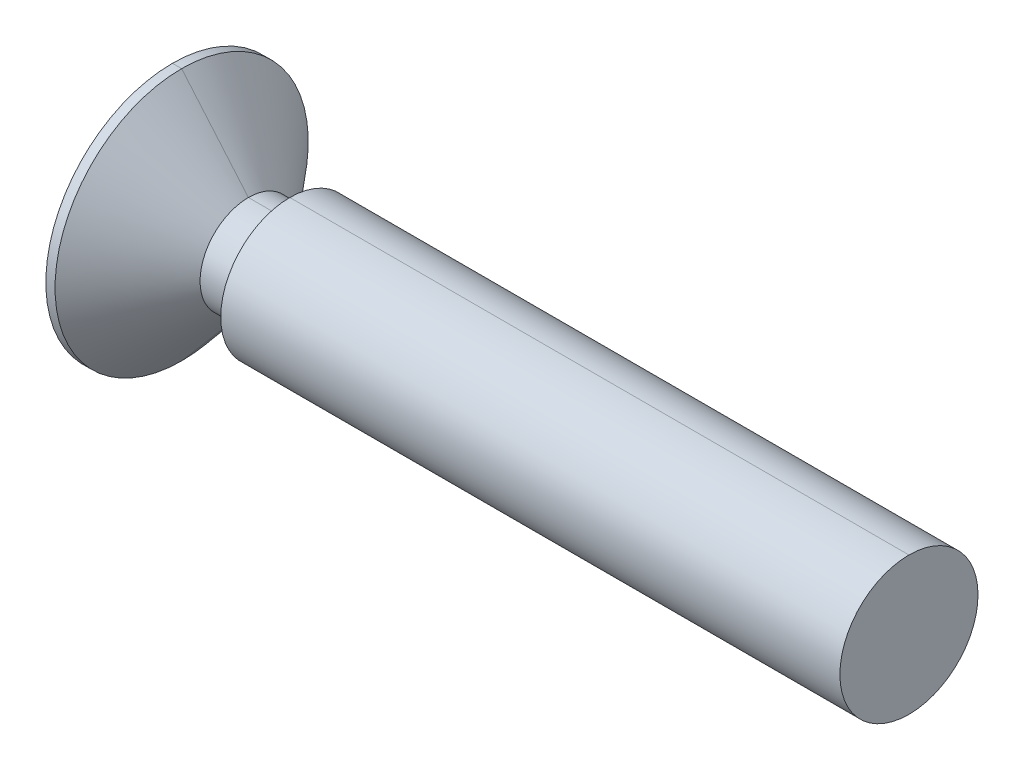
ISO-10303-21;
HEADER;
FILE_DESCRIPTION(('STEP AP214'),'2;1');
FILE_NAME('part.step','',(''),(''),'','','');
FILE_SCHEMA(('AUTOMOTIVE_DESIGN { 1 0 10303 214 1 1 1 1 }'));
ENDSEC;
DATA;
#1=APPLICATION_CONTEXT('core data for automotive mechanical design processes');
#2=APPLICATION_PROTOCOL_DEFINITION('international standard','automotive_design',2000,#1);
#3=PRODUCT_CONTEXT('',#1,'mechanical');
#4=PRODUCT('Part','Part','',(#3));
#5=PRODUCT_RELATED_PRODUCT_CATEGORY('part','',(#4));
#6=PRODUCT_DEFINITION_FORMATION('','',#4);
#7=PRODUCT_DEFINITION_CONTEXT('part definition',#1,'design');
#8=PRODUCT_DEFINITION('design','',#6,#7);
#9=PRODUCT_DEFINITION_SHAPE('','',#8);
#10=(LENGTH_UNIT() NAMED_UNIT(*) SI_UNIT(.MILLI.,.METRE.));
#11=(NAMED_UNIT(*) PLANE_ANGLE_UNIT() SI_UNIT($,.RADIAN.));
#12=(NAMED_UNIT(*) SI_UNIT($,.STERADIAN.) SOLID_ANGLE_UNIT());
#13=UNCERTAINTY_MEASURE_WITH_UNIT(LENGTH_MEASURE(1.E-05),#10,'distance_accuracy_value','');
#14=(GEOMETRIC_REPRESENTATION_CONTEXT(3) GLOBAL_UNCERTAINTY_ASSIGNED_CONTEXT((#13)) GLOBAL_UNIT_ASSIGNED_CONTEXT((#10,
#11,#12)) REPRESENTATION_CONTEXT('',''));
#15=CARTESIAN_POINT('',(0.,0.,0.));
#16=DIRECTION('',(0.,0.,1.));
#17=DIRECTION('',(1.,0.,0.));
#18=AXIS2_PLACEMENT_3D('',#15,#16,#17);
#19=CARTESIAN_POINT('',(-15.175,0.675,-0.675));
#20=DIRECTION('',(1.,0.,0.));
#21=DIRECTION('',(0.,1.,0.));
#22=AXIS2_PLACEMENT_3D('',#19,#20,#21);
#23=PLANE('',#22);
#24=DIRECTION('',(0.,-1.,0.));
#25=VECTOR('',#24,1.);
#26=CARTESIAN_POINT('',(-15.175,1.8,-0.375));
#27=LINE('',#26,#25);
#28=CARTESIAN_POINT('',(-15.175,1.8,-0.375));
#29=VERTEX_POINT('',#28);
#30=CARTESIAN_POINT('',(-15.175,0.675,-0.375));
#31=VERTEX_POINT('',#30);
#32=EDGE_CURVE('E426',#29,#31,#27,.T.);
#33=ORIENTED_EDGE('',*,*,#32,.T.);
#34=CARTESIAN_POINT('',(-15.175,0.675,-0.675));
#35=DIRECTION('',(1.,0.,0.));
#36=DIRECTION('',(0.,1.,0.));
#37=AXIS2_PLACEMENT_3D('',#34,#35,#36);
#38=CIRCLE('',#37,0.3);
#39=CARTESIAN_POINT('',(-15.175,0.375,-0.675));
#40=VERTEX_POINT('',#39);
#41=EDGE_CURVE('E10',#31,#40,#38,.T.);
#42=ORIENTED_EDGE('',*,*,#41,.T.);
#43=DIRECTION('',(0.,0.,-1.));
#44=VECTOR('',#43,1.);
#45=CARTESIAN_POINT('',(-15.175,0.375,-1.8));
#46=LINE('',#45,#44);
#47=CARTESIAN_POINT('',(-15.175,0.375,-1.8));
#48=VERTEX_POINT('',#47);
#49=EDGE_CURVE('E260',#40,#48,#46,.T.);
#50=ORIENTED_EDGE('',*,*,#49,.T.);
#51=DIRECTION('',(0.,-1.,0.));
#52=VECTOR('',#51,1.);
#53=CARTESIAN_POINT('',(-15.175,0.375,-1.8));
#54=LINE('',#53,#52);
#55=CARTESIAN_POINT('',(-15.175,-0.375,-1.8));
#56=VERTEX_POINT('',#55);
#57=EDGE_CURVE('E358',#48,#56,#54,.T.);
#58=ORIENTED_EDGE('',*,*,#57,.T.);
#59=DIRECTION('',(0.,0.,1.));
#60=VECTOR('',#59,1.);
#61=CARTESIAN_POINT('',(-15.175,-0.375,-1.8));
#62=LINE('',#61,#60);
#63=CARTESIAN_POINT('',(-15.175,-0.375,-0.675));
#64=VERTEX_POINT('',#63);
#65=EDGE_CURVE('E173',#56,#64,#62,.T.);
#66=ORIENTED_EDGE('',*,*,#65,.T.);
#67=CARTESIAN_POINT('',(-15.175,-0.675,-0.675));
#68=DIRECTION('',(1.,0.,0.));
#69=DIRECTION('',(0.,-1.,0.));
#70=AXIS2_PLACEMENT_3D('',#67,#68,#69);
#71=CIRCLE('',#70,0.3);
#72=CARTESIAN_POINT('',(-15.175,-0.675,-0.375));
#73=VERTEX_POINT('',#72);
#74=EDGE_CURVE('E185',#64,#73,#71,.T.);
#75=ORIENTED_EDGE('',*,*,#74,.T.);
#76=DIRECTION('',(0.,-1.,0.));
#77=VECTOR('',#76,1.);
#78=CARTESIAN_POINT('',(-15.175,-0.675,-0.375));
#79=LINE('',#78,#77);
#80=CARTESIAN_POINT('',(-15.175,-1.8,-0.375));
#81=VERTEX_POINT('',#80);
#82=EDGE_CURVE('E290',#73,#81,#79,.T.);
#83=ORIENTED_EDGE('',*,*,#82,.T.);
#84=DIRECTION('',(0.,0.,1.));
#85=VECTOR('',#84,1.);
#86=CARTESIAN_POINT('',(-15.175,-1.8,-0.375));
#87=LINE('',#86,#85);
#88=CARTESIAN_POINT('',(-15.175,-1.8,0.375));
#89=VERTEX_POINT('',#88);
#90=EDGE_CURVE('E234',#81,#89,#87,.T.);
#91=ORIENTED_EDGE('',*,*,#90,.T.);
#92=DIRECTION('',(0.,1.,0.));
#93=VECTOR('',#92,1.);
#94=CARTESIAN_POINT('',(-15.175,-0.675,0.375));
#95=LINE('',#94,#93);
#96=CARTESIAN_POINT('',(-15.175,-0.675,0.375));
#97=VERTEX_POINT('',#96);
#98=EDGE_CURVE('E240',#89,#97,#95,.T.);
#99=ORIENTED_EDGE('',*,*,#98,.T.);
#100=CARTESIAN_POINT('',(-15.175,-0.675,0.675));
#101=DIRECTION('',(1.,0.,0.));
#102=DIRECTION('',(0.,1.,0.));
#103=AXIS2_PLACEMENT_3D('',#100,#101,#102);
#104=CIRCLE('',#103,0.3);
#105=CARTESIAN_POINT('',(-15.175,-0.375,0.675));
#106=VERTEX_POINT('',#105);
#107=EDGE_CURVE('E359',#97,#106,#104,.T.);
#108=ORIENTED_EDGE('',*,*,#107,.T.);
#109=DIRECTION('',(0.,0.,1.));
#110=VECTOR('',#109,1.);
#111=CARTESIAN_POINT('',(-15.175,-0.375,0.675));
#112=LINE('',#111,#110);
#113=CARTESIAN_POINT('',(-15.175,-0.375,1.8));
#114=VERTEX_POINT('',#113);
#115=EDGE_CURVE('E330',#106,#114,#112,.T.);
#116=ORIENTED_EDGE('',*,*,#115,.T.);
#117=DIRECTION('',(0.,1.,0.));
#118=VECTOR('',#117,1.);
#119=CARTESIAN_POINT('',(-15.175,0.375,1.8));
#120=LINE('',#119,#118);
#121=CARTESIAN_POINT('',(-15.175,0.375,1.8));
#122=VERTEX_POINT('',#121);
#123=EDGE_CURVE('E320',#114,#122,#120,.T.);
#124=ORIENTED_EDGE('',*,*,#123,.T.);
#125=DIRECTION('',(0.,0.,-1.));
#126=VECTOR('',#125,1.);
#127=CARTESIAN_POINT('',(-15.175,0.375,0.675));
#128=LINE('',#127,#126);
#129=CARTESIAN_POINT('',(-15.175,0.375,0.675));
#130=VERTEX_POINT('',#129);
#131=EDGE_CURVE('E333',#122,#130,#128,.T.);
#132=ORIENTED_EDGE('',*,*,#131,.T.);
#133=CARTESIAN_POINT('',(-15.175,0.675,0.675));
#134=DIRECTION('',(1.,0.,0.));
#135=DIRECTION('',(0.,1.,0.));
#136=AXIS2_PLACEMENT_3D('',#133,#134,#135);
#137=CIRCLE('',#136,0.3);
#138=CARTESIAN_POINT('',(-15.175,0.675,0.375));
#139=VERTEX_POINT('',#138);
#140=EDGE_CURVE('E293',#130,#139,#137,.T.);
#141=ORIENTED_EDGE('',*,*,#140,.T.);
#142=DIRECTION('',(0.,1.,0.));
#143=VECTOR('',#142,1.);
#144=CARTESIAN_POINT('',(-15.175,1.8,0.375));
#145=LINE('',#144,#143);
#146=CARTESIAN_POINT('',(-15.175,1.8,0.375));
#147=VERTEX_POINT('',#146);
#148=EDGE_CURVE('E294',#139,#147,#145,.T.);
#149=ORIENTED_EDGE('',*,*,#148,.T.);
#150=DIRECTION('',(0.,0.,-1.));
#151=VECTOR('',#150,1.);
#152=CARTESIAN_POINT('',(-15.175,1.8,-0.375));
#153=LINE('',#152,#151);
#154=EDGE_CURVE('E354',#147,#29,#153,.T.);
#155=ORIENTED_EDGE('',*,*,#154,.T.);
#156=EDGE_LOOP('',(#33,#42,#50,#58,#66,#75,#83,#91,#99,#108,#116,#124,#132,#141,#149,#155));
#157=FACE_BOUND('',#156,.T.);
#158=ADVANCED_FACE('F16',(#157),#23,.F.);
#159=CARTESIAN_POINT('',(-15.175,0.675,-0.675));
#160=DIRECTION('',(-1.,0.,0.));
#161=DIRECTION('',(0.,-1.,0.));
#162=AXIS2_PLACEMENT_3D('',#159,#160,#161);
#163=CYLINDRICAL_SURFACE('',#162,0.3);
#164=CARTESIAN_POINT('',(-16.,0.675,-0.675));
#165=DIRECTION('',(1.,0.,0.));
#166=DIRECTION('',(0.,1.,0.));
#167=AXIS2_PLACEMENT_3D('',#164,#165,#166);
#168=CIRCLE('',#167,0.3);
#169=CARTESIAN_POINT('',(-16.,0.675,-0.375));
#170=VERTEX_POINT('',#169);
#171=CARTESIAN_POINT('',(-16.,0.375,-0.675));
#172=VERTEX_POINT('',#171);
#173=EDGE_CURVE('E265',#170,#172,#168,.T.);
#174=ORIENTED_EDGE('',*,*,#173,.T.);
#175=DIRECTION('',(-1.,0.,0.));
#176=VECTOR('',#175,1.);
#177=CARTESIAN_POINT('',(-15.175,0.375,-0.675));
#178=LINE('',#177,#176);
#179=EDGE_CURVE('E27',#40,#172,#178,.T.);
#180=ORIENTED_EDGE('',*,*,#179,.F.);
#181=ORIENTED_EDGE('',*,*,#41,.F.);
#182=DIRECTION('',(-1.,0.,0.));
#183=VECTOR('',#182,1.);
#184=CARTESIAN_POINT('',(-15.175,0.675,-0.375));
#185=LINE('',#184,#183);
#186=EDGE_CURVE('E268',#31,#170,#185,.T.);
#187=ORIENTED_EDGE('',*,*,#186,.T.);
#188=EDGE_LOOP('',(#174,#180,#181,#187));
#189=FACE_BOUND('',#188,.T.);
#190=ADVANCED_FACE('F266',(#189),#163,.T.);
#191=CARTESIAN_POINT('',(-15.175,0.375,-1.8));
#192=DIRECTION('',(0.,1.,0.));
#193=DIRECTION('',(1.,0.,0.));
#194=AXIS2_PLACEMENT_3D('',#191,#192,#193);
#195=PLANE('',#194);
#196=DIRECTION('',(0.,0.,-1.));
#197=VECTOR('',#196,1.);
#198=CARTESIAN_POINT('',(-16.,0.375,-1.8));
#199=LINE('',#198,#197);
#200=CARTESIAN_POINT('',(-16.,0.375,-1.8));
#201=VERTEX_POINT('',#200);
#202=EDGE_CURVE('E258',#172,#201,#199,.T.);
#203=ORIENTED_EDGE('',*,*,#202,.T.);
#204=DIRECTION('',(-1.,0.,0.));
#205=VECTOR('',#204,1.);
#206=CARTESIAN_POINT('',(-15.175,0.375,-1.8));
#207=LINE('',#206,#205);
#208=EDGE_CURVE('E402',#48,#201,#207,.T.);
#209=ORIENTED_EDGE('',*,*,#208,.F.);
#210=ORIENTED_EDGE('',*,*,#49,.F.);
#211=ORIENTED_EDGE('',*,*,#179,.T.);
#212=EDGE_LOOP('',(#203,#209,#210,#211));
#213=FACE_BOUND('',#212,.T.);
#214=ADVANCED_FACE('F255',(#213),#195,.F.);
#215=CARTESIAN_POINT('',(-15.175,0.375,-1.8));
#216=DIRECTION('',(0.,0.,-1.));
#217=DIRECTION('',(0.,-1.,0.));
#218=AXIS2_PLACEMENT_3D('',#215,#216,#217);
#219=PLANE('',#218);
#220=DIRECTION('',(0.,-1.,0.));
#221=VECTOR('',#220,1.);
#222=CARTESIAN_POINT('',(-16.,0.375,-1.8));
#223=LINE('',#222,#221);
#224=CARTESIAN_POINT('',(-16.,-0.375,-1.8));
#225=VERTEX_POINT('',#224);
#226=EDGE_CURVE('E278',#201,#225,#223,.T.);
#227=ORIENTED_EDGE('',*,*,#226,.T.);
#228=DIRECTION('',(-1.,0.,0.));
#229=VECTOR('',#228,1.);
#230=CARTESIAN_POINT('',(-15.175,-0.375,-1.8));
#231=LINE('',#230,#229);
#232=EDGE_CURVE('E355',#56,#225,#231,.T.);
#233=ORIENTED_EDGE('',*,*,#232,.F.);
#234=ORIENTED_EDGE('',*,*,#57,.F.);
#235=ORIENTED_EDGE('',*,*,#208,.T.);
#236=EDGE_LOOP('',(#227,#233,#234,#235));
#237=FACE_BOUND('',#236,.T.);
#238=ADVANCED_FACE('F656',(#237),#219,.F.);
#239=CARTESIAN_POINT('',(-15.175,-0.375,-1.8));
#240=DIRECTION('',(0.,-1.,0.));
#241=DIRECTION('',(0.,0.,-1.));
#242=AXIS2_PLACEMENT_3D('',#239,#240,#241);
#243=PLANE('',#242);
#244=DIRECTION('',(0.,0.,1.));
#245=VECTOR('',#244,1.);
#246=CARTESIAN_POINT('',(-16.,-0.375,-1.8));
#247=LINE('',#246,#245);
#248=CARTESIAN_POINT('',(-16.,-0.375,-0.675));
#249=VERTEX_POINT('',#248);
#250=EDGE_CURVE('E286',#225,#249,#247,.T.);
#251=ORIENTED_EDGE('',*,*,#250,.T.);
#252=DIRECTION('',(-1.,0.,0.));
#253=VECTOR('',#252,1.);
#254=CARTESIAN_POINT('',(-15.175,-0.375,-0.675));
#255=LINE('',#254,#253);
#256=EDGE_CURVE('E378',#64,#249,#255,.T.);
#257=ORIENTED_EDGE('',*,*,#256,.F.);
#258=ORIENTED_EDGE('',*,*,#65,.F.);
#259=ORIENTED_EDGE('',*,*,#232,.T.);
#260=EDGE_LOOP('',(#251,#257,#258,#259));
#261=FACE_BOUND('',#260,.T.);
#262=ADVANCED_FACE('F660',(#261),#243,.F.);
#263=CARTESIAN_POINT('',(-15.175,-0.675,-0.675));
#264=DIRECTION('',(-1.,0.,0.));
#265=DIRECTION('',(0.,-1.,0.));
#266=AXIS2_PLACEMENT_3D('',#263,#264,#265);
#267=CYLINDRICAL_SURFACE('',#266,0.3);
#268=CARTESIAN_POINT('',(-16.,-0.675,-0.675));
#269=DIRECTION('',(1.,0.,0.));
#270=DIRECTION('',(0.,-1.,0.));
#271=AXIS2_PLACEMENT_3D('',#268,#269,#270);
#272=CIRCLE('',#271,0.3);
#273=CARTESIAN_POINT('',(-16.,-0.675,-0.375));
#274=VERTEX_POINT('',#273);
#275=EDGE_CURVE('E441',#249,#274,#272,.T.);
#276=ORIENTED_EDGE('',*,*,#275,.T.);
#277=DIRECTION('',(-1.,0.,0.));
#278=VECTOR('',#277,1.);
#279=CARTESIAN_POINT('',(-15.175,-0.675,-0.375));
#280=LINE('',#279,#278);
#281=EDGE_CURVE('E425',#73,#274,#280,.T.);
#282=ORIENTED_EDGE('',*,*,#281,.F.);
#283=ORIENTED_EDGE('',*,*,#74,.F.);
#284=ORIENTED_EDGE('',*,*,#256,.T.);
#285=EDGE_LOOP('',(#276,#282,#283,#284));
#286=FACE_BOUND('',#285,.T.);
#287=ADVANCED_FACE('F741',(#286),#267,.T.);
#288=CARTESIAN_POINT('',(-15.175,-0.675,-0.375));
#289=DIRECTION('',(0.,0.,-1.));
#290=DIRECTION('',(0.,-1.,0.));
#291=AXIS2_PLACEMENT_3D('',#288,#289,#290);
#292=PLANE('',#291);
#293=DIRECTION('',(0.,-1.,0.));
#294=VECTOR('',#293,1.);
#295=CARTESIAN_POINT('',(-16.,-0.675,-0.375));
#296=LINE('',#295,#294);
#297=CARTESIAN_POINT('',(-16.,-1.8,-0.375));
#298=VERTEX_POINT('',#297);
#299=EDGE_CURVE('E1041',#274,#298,#296,.T.);
#300=ORIENTED_EDGE('',*,*,#299,.T.);
#301=DIRECTION('',(-1.,0.,0.));
#302=VECTOR('',#301,1.);
#303=CARTESIAN_POINT('',(-15.175,-1.8,-0.375));
#304=LINE('',#303,#302);
#305=EDGE_CURVE('E143',#81,#298,#304,.T.);
#306=ORIENTED_EDGE('',*,*,#305,.F.);
#307=ORIENTED_EDGE('',*,*,#82,.F.);
#308=ORIENTED_EDGE('',*,*,#281,.T.);
#309=EDGE_LOOP('',(#300,#306,#307,#308));
#310=FACE_BOUND('',#309,.T.);
#311=ADVANCED_FACE('F18',(#310),#292,.F.);
#312=CARTESIAN_POINT('',(-15.175,-1.8,-0.375));
#313=DIRECTION('',(0.,-1.,0.));
#314=DIRECTION('',(0.,0.,-1.));
#315=AXIS2_PLACEMENT_3D('',#312,#313,#314);
#316=PLANE('',#315);
#317=DIRECTION('',(0.,0.,1.));
#318=VECTOR('',#317,1.);
#319=CARTESIAN_POINT('',(-16.,-1.8,-0.375));
#320=LINE('',#319,#318);
#321=CARTESIAN_POINT('',(-16.,-1.8,0.375));
#322=VERTEX_POINT('',#321);
#323=EDGE_CURVE('E1044',#298,#322,#320,.T.);
#324=ORIENTED_EDGE('',*,*,#323,.T.);
#325=DIRECTION('',(-1.,0.,0.));
#326=VECTOR('',#325,1.);
#327=CARTESIAN_POINT('',(-15.175,-1.8,0.375));
#328=LINE('',#327,#326);
#329=EDGE_CURVE('E156',#89,#322,#328,.T.);
#330=ORIENTED_EDGE('',*,*,#329,.F.);
#331=ORIENTED_EDGE('',*,*,#90,.F.);
#332=ORIENTED_EDGE('',*,*,#305,.T.);
#333=EDGE_LOOP('',(#324,#330,#331,#332));
#334=FACE_BOUND('',#333,.T.);
#335=ADVANCED_FACE('F679',(#334),#316,.F.);
#336=CARTESIAN_POINT('',(-15.175,-0.675,0.375));
#337=DIRECTION('',(0.,0.,1.));
#338=DIRECTION('',(0.,-1.,0.));
#339=AXIS2_PLACEMENT_3D('',#336,#337,#338);
#340=PLANE('',#339);
#341=DIRECTION('',(0.,1.,0.));
#342=VECTOR('',#341,1.);
#343=CARTESIAN_POINT('',(-16.,-0.675,0.375));
#344=LINE('',#343,#342);
#345=CARTESIAN_POINT('',(-16.,-0.675,0.375));
#346=VERTEX_POINT('',#345);
#347=EDGE_CURVE('E367',#322,#346,#344,.T.);
#348=ORIENTED_EDGE('',*,*,#347,.T.);
#349=DIRECTION('',(-1.,0.,0.));
#350=VECTOR('',#349,1.);
#351=CARTESIAN_POINT('',(-15.175,-0.675,0.375));
#352=LINE('',#351,#350);
#353=EDGE_CURVE('E302',#97,#346,#352,.T.);
#354=ORIENTED_EDGE('',*,*,#353,.F.);
#355=ORIENTED_EDGE('',*,*,#98,.F.);
#356=ORIENTED_EDGE('',*,*,#329,.T.);
#357=EDGE_LOOP('',(#348,#354,#355,#356));
#358=FACE_BOUND('',#357,.T.);
#359=ADVANCED_FACE('F675',(#358),#340,.F.);
#360=CARTESIAN_POINT('',(-15.175,-0.675,0.675));
#361=DIRECTION('',(-1.,0.,0.));
#362=DIRECTION('',(0.,-1.,0.));
#363=AXIS2_PLACEMENT_3D('',#360,#361,#362);
#364=CYLINDRICAL_SURFACE('',#363,0.3);
#365=CARTESIAN_POINT('',(-16.,-0.675,0.675));
#366=DIRECTION('',(1.,0.,0.));
#367=DIRECTION('',(0.,1.,0.));
#368=AXIS2_PLACEMENT_3D('',#365,#366,#367);
#369=CIRCLE('',#368,0.3);
#370=CARTESIAN_POINT('',(-16.,-0.375,0.675));
#371=VERTEX_POINT('',#370);
#372=EDGE_CURVE('E363',#346,#371,#369,.T.);
#373=ORIENTED_EDGE('',*,*,#372,.T.);
#374=DIRECTION('',(-1.,0.,0.));
#375=VECTOR('',#374,1.);
#376=CARTESIAN_POINT('',(-15.175,-0.375,0.675));
#377=LINE('',#376,#375);
#378=EDGE_CURVE('E362',#106,#371,#377,.T.);
#379=ORIENTED_EDGE('',*,*,#378,.F.);
#380=ORIENTED_EDGE('',*,*,#107,.F.);
#381=ORIENTED_EDGE('',*,*,#353,.T.);
#382=EDGE_LOOP('',(#373,#379,#380,#381));
#383=FACE_BOUND('',#382,.T.);
#384=ADVANCED_FACE('F460',(#383),#364,.T.);
#385=CARTESIAN_POINT('',(-15.175,-0.375,0.675));
#386=DIRECTION('',(0.,-1.,0.));
#387=DIRECTION('',(0.,0.,-1.));
#388=AXIS2_PLACEMENT_3D('',#385,#386,#387);
#389=PLANE('',#388);
#390=DIRECTION('',(0.,0.,1.));
#391=VECTOR('',#390,1.);
#392=CARTESIAN_POINT('',(-16.,-0.375,0.675));
#393=LINE('',#392,#391);
#394=CARTESIAN_POINT('',(-16.,-0.375,1.8));
#395=VERTEX_POINT('',#394);
#396=EDGE_CURVE('E368',#371,#395,#393,.T.);
#397=ORIENTED_EDGE('',*,*,#396,.T.);
#398=DIRECTION('',(-1.,0.,0.));
#399=VECTOR('',#398,1.);
#400=CARTESIAN_POINT('',(-15.175,-0.375,1.8));
#401=LINE('',#400,#399);
#402=EDGE_CURVE('E322',#114,#395,#401,.T.);
#403=ORIENTED_EDGE('',*,*,#402,.F.);
#404=ORIENTED_EDGE('',*,*,#115,.F.);
#405=ORIENTED_EDGE('',*,*,#378,.T.);
#406=EDGE_LOOP('',(#397,#403,#404,#405));
#407=FACE_BOUND('',#406,.T.);
#408=ADVANCED_FACE('F453',(#407),#389,.F.);
#409=CARTESIAN_POINT('',(-15.175,0.375,1.8));
#410=DIRECTION('',(0.,0.,1.));
#411=DIRECTION('',(1.,0.,0.));
#412=AXIS2_PLACEMENT_3D('',#409,#410,#411);
#413=PLANE('',#412);
#414=DIRECTION('',(0.,1.,0.));
#415=VECTOR('',#414,1.);
#416=CARTESIAN_POINT('',(-16.,0.375,1.8));
#417=LINE('',#416,#415);
#418=CARTESIAN_POINT('',(-16.,0.375,1.8));
#419=VERTEX_POINT('',#418);
#420=EDGE_CURVE('E388',#395,#419,#417,.T.);
#421=ORIENTED_EDGE('',*,*,#420,.T.);
#422=DIRECTION('',(-1.,0.,0.));
#423=VECTOR('',#422,1.);
#424=CARTESIAN_POINT('',(-15.175,0.375,1.8));
#425=LINE('',#424,#423);
#426=EDGE_CURVE('E323',#122,#419,#425,.T.);
#427=ORIENTED_EDGE('',*,*,#426,.F.);
#428=ORIENTED_EDGE('',*,*,#123,.F.);
#429=ORIENTED_EDGE('',*,*,#402,.T.);
#430=EDGE_LOOP('',(#421,#427,#428,#429));
#431=FACE_BOUND('',#430,.T.);
#432=ADVANCED_FACE('F646',(#431),#413,.F.);
#433=CARTESIAN_POINT('',(-15.175,0.375,0.675));
#434=DIRECTION('',(0.,1.,0.));
#435=DIRECTION('',(0.,0.,-1.));
#436=AXIS2_PLACEMENT_3D('',#433,#434,#435);
#437=PLANE('',#436);
#438=DIRECTION('',(0.,0.,-1.));
#439=VECTOR('',#438,1.);
#440=CARTESIAN_POINT('',(-16.,0.375,0.675));
#441=LINE('',#440,#439);
#442=CARTESIAN_POINT('',(-16.,0.375,0.675));
#443=VERTEX_POINT('',#442);
#444=EDGE_CURVE('E386',#419,#443,#441,.T.);
#445=ORIENTED_EDGE('',*,*,#444,.T.);
#446=DIRECTION('',(-1.,0.,0.));
#447=VECTOR('',#446,1.);
#448=CARTESIAN_POINT('',(-15.175,0.375,0.675));
#449=LINE('',#448,#447);
#450=EDGE_CURVE('E205',#130,#443,#449,.T.);
#451=ORIENTED_EDGE('',*,*,#450,.F.);
#452=ORIENTED_EDGE('',*,*,#131,.F.);
#453=ORIENTED_EDGE('',*,*,#426,.T.);
#454=EDGE_LOOP('',(#445,#451,#452,#453));
#455=FACE_BOUND('',#454,.T.);
#456=ADVANCED_FACE('F650',(#455),#437,.F.);
#457=CARTESIAN_POINT('',(-15.175,0.675,0.675));
#458=DIRECTION('',(-1.,0.,0.));
#459=DIRECTION('',(0.,-1.,0.));
#460=AXIS2_PLACEMENT_3D('',#457,#458,#459);
#461=CYLINDRICAL_SURFACE('',#460,0.3);
#462=CARTESIAN_POINT('',(-16.,0.675,0.675));
#463=DIRECTION('',(1.,0.,0.));
#464=DIRECTION('',(0.,1.,0.));
#465=AXIS2_PLACEMENT_3D('',#462,#463,#464);
#466=CIRCLE('',#465,0.3);
#467=CARTESIAN_POINT('',(-16.,0.675,0.375));
#468=VERTEX_POINT('',#467);
#469=EDGE_CURVE('E389',#443,#468,#466,.T.);
#470=ORIENTED_EDGE('',*,*,#469,.T.);
#471=DIRECTION('',(-1.,0.,0.));
#472=VECTOR('',#471,1.);
#473=CARTESIAN_POINT('',(-15.175,0.675,0.375));
#474=LINE('',#473,#472);
#475=EDGE_CURVE('E221',#139,#468,#474,.T.);
#476=ORIENTED_EDGE('',*,*,#475,.F.);
#477=ORIENTED_EDGE('',*,*,#140,.F.);
#478=ORIENTED_EDGE('',*,*,#450,.T.);
#479=EDGE_LOOP('',(#470,#476,#477,#478));
#480=FACE_BOUND('',#479,.T.);
#481=ADVANCED_FACE('F725',(#480),#461,.T.);
#482=CARTESIAN_POINT('',(-15.175,1.8,0.375));
#483=DIRECTION('',(0.,0.,1.));
#484=DIRECTION('',(0.,-1.,0.));
#485=AXIS2_PLACEMENT_3D('',#482,#483,#484);
#486=PLANE('',#485);
#487=DIRECTION('',(0.,1.,0.));
#488=VECTOR('',#487,1.);
#489=CARTESIAN_POINT('',(-16.,1.8,0.375));
#490=LINE('',#489,#488);
#491=CARTESIAN_POINT('',(-16.,1.8,0.375));
#492=VERTEX_POINT('',#491);
#493=EDGE_CURVE('E405',#468,#492,#490,.T.);
#494=ORIENTED_EDGE('',*,*,#493,.T.);
#495=DIRECTION('',(-1.,0.,0.));
#496=VECTOR('',#495,1.);
#497=CARTESIAN_POINT('',(-15.175,1.8,0.375));
#498=LINE('',#497,#496);
#499=EDGE_CURVE('E351',#147,#492,#498,.T.);
#500=ORIENTED_EDGE('',*,*,#499,.F.);
#501=ORIENTED_EDGE('',*,*,#148,.F.);
#502=ORIENTED_EDGE('',*,*,#475,.T.);
#503=EDGE_LOOP('',(#494,#500,#501,#502));
#504=FACE_BOUND('',#503,.T.);
#505=ADVANCED_FACE('F696',(#504),#486,.F.);
#506=CARTESIAN_POINT('',(-15.175,1.8,-0.375));
#507=DIRECTION('',(0.,1.,0.));
#508=DIRECTION('',(0.,0.,-1.));
#509=AXIS2_PLACEMENT_3D('',#506,#507,#508);
#510=PLANE('',#509);
#511=DIRECTION('',(0.,0.,-1.));
#512=VECTOR('',#511,1.);
#513=CARTESIAN_POINT('',(-16.,1.8,-0.375));
#514=LINE('',#513,#512);
#515=CARTESIAN_POINT('',(-16.,1.8,-0.375));
#516=VERTEX_POINT('',#515);
#517=EDGE_CURVE('E417',#492,#516,#514,.T.);
#518=ORIENTED_EDGE('',*,*,#517,.T.);
#519=DIRECTION('',(-1.,0.,0.));
#520=VECTOR('',#519,1.);
#521=CARTESIAN_POINT('',(-15.175,1.8,-0.375));
#522=LINE('',#521,#520);
#523=EDGE_CURVE('E20',#29,#516,#522,.T.);
#524=ORIENTED_EDGE('',*,*,#523,.F.);
#525=ORIENTED_EDGE('',*,*,#154,.F.);
#526=ORIENTED_EDGE('',*,*,#499,.T.);
#527=EDGE_LOOP('',(#518,#524,#525,#526));
#528=FACE_BOUND('',#527,.T.);
#529=ADVANCED_FACE('F691',(#528),#510,.F.);
#530=CARTESIAN_POINT('',(-15.175,1.8,-0.375));
#531=DIRECTION('',(0.,0.,-1.));
#532=DIRECTION('',(0.,-1.,0.));
#533=AXIS2_PLACEMENT_3D('',#530,#531,#532);
#534=PLANE('',#533);
#535=DIRECTION('',(0.,-1.,0.));
#536=VECTOR('',#535,1.);
#537=CARTESIAN_POINT('',(-16.,1.8,-0.375));
#538=LINE('',#537,#536);
#539=EDGE_CURVE('E398',#516,#170,#538,.T.);
#540=ORIENTED_EDGE('',*,*,#539,.T.);
#541=ORIENTED_EDGE('',*,*,#186,.F.);
#542=ORIENTED_EDGE('',*,*,#32,.F.);
#543=ORIENTED_EDGE('',*,*,#523,.T.);
#544=EDGE_LOOP('',(#540,#541,#542,#543));
#545=FACE_BOUND('',#544,.T.);
#546=ADVANCED_FACE('F695',(#545),#534,.F.);
#547=CARTESIAN_POINT('',(-16.,2.75,0.));
#548=DIRECTION('',(-1.,0.,0.));
#549=DIRECTION('',(0.,1.,0.));
#550=AXIS2_PLACEMENT_3D('',#547,#548,#549);
#551=PLANE('',#550);
#552=ORIENTED_EDGE('',*,*,#539,.F.);
#553=ORIENTED_EDGE('',*,*,#517,.F.);
#554=ORIENTED_EDGE('',*,*,#493,.F.);
#555=ORIENTED_EDGE('',*,*,#469,.F.);
#556=ORIENTED_EDGE('',*,*,#444,.F.);
#557=ORIENTED_EDGE('',*,*,#420,.F.);
#558=ORIENTED_EDGE('',*,*,#396,.F.);
#559=ORIENTED_EDGE('',*,*,#372,.F.);
#560=ORIENTED_EDGE('',*,*,#347,.F.);
#561=ORIENTED_EDGE('',*,*,#323,.F.);
#562=ORIENTED_EDGE('',*,*,#299,.F.);
#563=ORIENTED_EDGE('',*,*,#275,.F.);
#564=ORIENTED_EDGE('',*,*,#250,.F.);
#565=ORIENTED_EDGE('',*,*,#226,.F.);
#566=ORIENTED_EDGE('',*,*,#202,.F.);
#567=ORIENTED_EDGE('',*,*,#173,.F.);
#568=EDGE_LOOP('',(#552,#553,#554,#555,#556,#557,#558,#559,#560,#561,#562,#563,#564,#565,#566,#567));
#569=FACE_BOUND('',#568,.T.);
#570=CARTESIAN_POINT('',(-16.,0.,0.));
#571=DIRECTION('',(1.,0.,0.));
#572=DIRECTION('',(0.,1.,0.));
#573=AXIS2_PLACEMENT_3D('',#570,#571,#572);
#574=CIRCLE('',#573,2.75);
#575=CARTESIAN_POINT('',(-16.,2.75,0.));
#576=VERTEX_POINT('',#575);
#577=CARTESIAN_POINT('',(-16.,-2.75,0.));
#578=VERTEX_POINT('',#577);
#579=EDGE_CURVE('E391',#576,#578,#574,.T.);
#580=ORIENTED_EDGE('',*,*,#579,.F.);
#581=CARTESIAN_POINT('',(-16.,0.,0.));
#582=DIRECTION('',(1.,0.,0.));
#583=DIRECTION('',(0.,1.,0.));
#584=AXIS2_PLACEMENT_3D('',#581,#582,#583);
#585=CIRCLE('',#584,2.75);
#586=EDGE_CURVE('E395',#578,#576,#585,.T.);
#587=ORIENTED_EDGE('',*,*,#586,.F.);
#588=EDGE_LOOP('',(#580,#587));
#589=FACE_BOUND('',#588,.T.);
#590=ADVANCED_FACE('F274',(#569,#589),#551,.T.);
#591=CARTESIAN_POINT('',(0.,0.,0.));
#592=DIRECTION('',(1.,0.,0.));
#593=DIRECTION('',(0.,1.,0.));
#594=AXIS2_PLACEMENT_3D('',#591,#592,#593);
#595=CYLINDRICAL_SURFACE('',#594,2.75);
#596=DIRECTION('',(1.,0.,0.));
#597=VECTOR('',#596,1.);
#598=CARTESIAN_POINT('',(0.,-2.75,0.));
#599=LINE('',#598,#597);
#600=CARTESIAN_POINT('',(-15.8,-2.75,0.));
#601=VERTEX_POINT('',#600);
#602=EDGE_CURVE('E383',#578,#601,#599,.T.);
#603=ORIENTED_EDGE('',*,*,#602,.F.);
#604=ORIENTED_EDGE('',*,*,#586,.T.);
#605=DIRECTION('',(1.,0.,0.));
#606=VECTOR('',#605,1.);
#607=CARTESIAN_POINT('',(0.,2.75,0.));
#608=LINE('',#607,#606);
#609=CARTESIAN_POINT('',(-15.8,2.75,0.));
#610=VERTEX_POINT('',#609);
#611=EDGE_CURVE('E300',#576,#610,#608,.T.);
#612=ORIENTED_EDGE('',*,*,#611,.T.);
#613=CARTESIAN_POINT('',(-15.8,0.,0.));
#614=DIRECTION('',(1.,0.,0.));
#615=DIRECTION('',(0.,1.,0.));
#616=AXIS2_PLACEMENT_3D('',#613,#614,#615);
#617=CIRCLE('',#616,2.75);
#618=EDGE_CURVE('E399',#601,#610,#617,.T.);
#619=ORIENTED_EDGE('',*,*,#618,.F.);
#620=EDGE_LOOP('',(#603,#604,#612,#619));
#621=FACE_BOUND('',#620,.T.);
#622=ADVANCED_FACE('F736',(#621),#595,.T.);
#623=CARTESIAN_POINT('',(-14.35,0.,0.));
#624=DIRECTION('',(-1.,0.,0.));
#625=DIRECTION('',(0.,-1.,0.));
#626=AXIS2_PLACEMENT_3D('',#623,#624,#625);
#627=CONICAL_SURFACE('',#626,1.05,0.864597234366899);
#628=DIRECTION('',(-0.64894660608275,0.760833951959085,0.));
#629=VECTOR('',#628,1.);
#630=CARTESIAN_POINT('',(-14.35,1.05,0.));
#631=LINE('',#630,#629);
#632=CARTESIAN_POINT('',(-14.35,1.05,0.));
#633=VERTEX_POINT('',#632);
#634=EDGE_CURVE('E299',#633,#610,#631,.T.);
#635=ORIENTED_EDGE('',*,*,#634,.F.);
#636=CARTESIAN_POINT('',(-14.35,0.,0.));
#637=DIRECTION('',(1.,0.,0.));
#638=DIRECTION('',(0.,1.,0.));
#639=AXIS2_PLACEMENT_3D('',#636,#637,#638);
#640=CIRCLE('',#639,1.05);
#641=CARTESIAN_POINT('',(-14.35,-1.05,0.));
#642=VERTEX_POINT('',#641);
#643=EDGE_CURVE('E409',#642,#633,#640,.T.);
#644=ORIENTED_EDGE('',*,*,#643,.F.);
#645=DIRECTION('',(-0.64894660608275,-0.760833951959086,0.));
#646=VECTOR('',#645,1.);
#647=CARTESIAN_POINT('',(-14.35,-1.05,0.));
#648=LINE('',#647,#646);
#649=EDGE_CURVE('E304',#642,#601,#648,.T.);
#650=ORIENTED_EDGE('',*,*,#649,.T.);
#651=ORIENTED_EDGE('',*,*,#618,.T.);
#652=EDGE_LOOP('',(#635,#644,#650,#651));
#653=FACE_BOUND('',#652,.T.);
#654=ADVANCED_FACE('F669',(#653),#627,.T.);
#655=CARTESIAN_POINT('',(0.,0.,0.));
#656=DIRECTION('',(1.,0.,0.));
#657=DIRECTION('',(0.,1.,0.));
#658=AXIS2_PLACEMENT_3D('',#655,#656,#657);
#659=CYLINDRICAL_SURFACE('',#658,1.05);
#660=DIRECTION('',(1.,0.,0.));
#661=VECTOR('',#660,1.);
#662=CARTESIAN_POINT('',(0.,-1.05,0.));
#663=LINE('',#662,#661);
#664=CARTESIAN_POINT('',(-13.45,-1.05,0.));
#665=VERTEX_POINT('',#664);
#666=EDGE_CURVE('E308',#642,#665,#663,.T.);
#667=ORIENTED_EDGE('',*,*,#666,.F.);
#668=ORIENTED_EDGE('',*,*,#643,.T.);
#669=DIRECTION('',(1.,0.,0.));
#670=VECTOR('',#669,1.);
#671=CARTESIAN_POINT('',(0.,1.05,0.));
#672=LINE('',#671,#670);
#673=CARTESIAN_POINT('',(-13.45,1.05,0.));
#674=VERTEX_POINT('',#673);
#675=EDGE_CURVE('E347',#633,#674,#672,.T.);
#676=ORIENTED_EDGE('',*,*,#675,.T.);
#677=CARTESIAN_POINT('',(-13.45,0.,0.));
#678=DIRECTION('',(1.,0.,0.));
#679=DIRECTION('',(0.,1.,0.));
#680=AXIS2_PLACEMENT_3D('',#677,#678,#679);
#681=CIRCLE('',#680,1.05);
#682=EDGE_CURVE('E406',#665,#674,#681,.T.);
#683=ORIENTED_EDGE('',*,*,#682,.F.);
#684=EDGE_LOOP('',(#667,#668,#676,#683));
#685=FACE_BOUND('',#684,.T.);
#686=ADVANCED_FACE('F640',(#685),#659,.T.);
#687=CARTESIAN_POINT('',(-13.45,1.5,0.));
#688=DIRECTION('',(-1.,0.,0.));
#689=DIRECTION('',(0.,1.,0.));
#690=AXIS2_PLACEMENT_3D('',#687,#688,#689);
#691=PLANE('',#690);
#692=CARTESIAN_POINT('',(-13.45,0.,0.));
#693=DIRECTION('',(1.,0.,0.));
#694=DIRECTION('',(0.,1.,0.));
#695=AXIS2_PLACEMENT_3D('',#692,#693,#694);
#696=CIRCLE('',#695,1.05);
#697=EDGE_CURVE('E318',#674,#665,#696,.T.);
#698=ORIENTED_EDGE('',*,*,#697,.T.);
#699=ORIENTED_EDGE('',*,*,#682,.T.);
#700=EDGE_LOOP('',(#698,#699));
#701=FACE_BOUND('',#700,.T.);
#702=CARTESIAN_POINT('',(-13.45,0.,0.));
#703=DIRECTION('',(1.,0.,0.));
#704=DIRECTION('',(0.,1.,0.));
#705=AXIS2_PLACEMENT_3D('',#702,#703,#704);
#706=CIRCLE('',#705,1.5);
#707=CARTESIAN_POINT('',(-13.45,1.5,0.));
#708=VERTEX_POINT('',#707);
#709=CARTESIAN_POINT('',(-13.45,-1.5,0.));
#710=VERTEX_POINT('',#709);
#711=EDGE_CURVE('E344',#708,#710,#706,.T.);
#712=ORIENTED_EDGE('',*,*,#711,.F.);
#713=CARTESIAN_POINT('',(-13.45,0.,0.));
#714=DIRECTION('',(1.,0.,0.));
#715=DIRECTION('',(0.,1.,0.));
#716=AXIS2_PLACEMENT_3D('',#713,#714,#715);
#717=CIRCLE('',#716,1.5);
#718=EDGE_CURVE('E372',#710,#708,#717,.T.);
#719=ORIENTED_EDGE('',*,*,#718,.F.);
#720=EDGE_LOOP('',(#712,#719));
#721=FACE_BOUND('',#720,.T.);
#722=ADVANCED_FACE('F635',(#701,#721),#691,.T.);
#723=CARTESIAN_POINT('',(0.,0.,0.));
#724=DIRECTION('',(1.,0.,0.));
#725=DIRECTION('',(0.,1.,0.));
#726=AXIS2_PLACEMENT_3D('',#723,#724,#725);
#727=CYLINDRICAL_SURFACE('',#726,1.5);
#728=DIRECTION('',(1.,0.,0.));
#729=VECTOR('',#728,1.);
#730=CARTESIAN_POINT('',(0.,-1.5,0.));
#731=LINE('',#730,#729);
#732=CARTESIAN_POINT('',(0.,-1.5,0.));
#733=VERTEX_POINT('',#732);
#734=EDGE_CURVE('E314',#710,#733,#731,.T.);
#735=ORIENTED_EDGE('',*,*,#734,.F.);
#736=ORIENTED_EDGE('',*,*,#718,.T.);
#737=DIRECTION('',(1.,0.,0.));
#738=VECTOR('',#737,1.);
#739=CARTESIAN_POINT('',(0.,1.5,0.));
#740=LINE('',#739,#738);
#741=CARTESIAN_POINT('',(0.,1.5,0.));
#742=VERTEX_POINT('',#741);
#743=EDGE_CURVE('E313',#708,#742,#740,.T.);
#744=ORIENTED_EDGE('',*,*,#743,.T.);
#745=CARTESIAN_POINT('',(0.,0.,0.));
#746=DIRECTION('',(1.,0.,0.));
#747=DIRECTION('',(0.,1.,0.));
#748=AXIS2_PLACEMENT_3D('',#745,#746,#747);
#749=CIRCLE('',#748,1.5);
#750=EDGE_CURVE('E369',#733,#742,#749,.T.);
#751=ORIENTED_EDGE('',*,*,#750,.F.);
#752=EDGE_LOOP('',(#735,#736,#744,#751));
#753=FACE_BOUND('',#752,.T.);
#754=ADVANCED_FACE('F639',(#753),#727,.T.);
#755=CARTESIAN_POINT('',(0.,0.,0.));
#756=DIRECTION('',(1.,0.,0.));
#757=DIRECTION('',(0.,1.,0.));
#758=AXIS2_PLACEMENT_3D('',#755,#756,#757);
#759=PLANE('',#758);
#760=CARTESIAN_POINT('',(0.,0.,0.));
#761=DIRECTION('',(1.,0.,0.));
#762=DIRECTION('',(0.,1.,0.));
#763=AXIS2_PLACEMENT_3D('',#760,#761,#762);
#764=CIRCLE('',#763,1.5);
#765=EDGE_CURVE('E309',#742,#733,#764,.T.);
#766=ORIENTED_EDGE('',*,*,#765,.T.);
#767=ORIENTED_EDGE('',*,*,#750,.T.);
#768=EDGE_LOOP('',(#766,#767));
#769=FACE_BOUND('',#768,.T.);
#770=ADVANCED_FACE('F629',(#769),#759,.T.);
#771=CARTESIAN_POINT('',(0.,0.,0.));
#772=DIRECTION('',(1.,0.,0.));
#773=DIRECTION('',(0.,1.,0.));
#774=AXIS2_PLACEMENT_3D('',#771,#772,#773);
#775=CYLINDRICAL_SURFACE('',#774,1.5);
#776=ORIENTED_EDGE('',*,*,#711,.T.);
#777=ORIENTED_EDGE('',*,*,#734,.T.);
#778=ORIENTED_EDGE('',*,*,#765,.F.);
#779=ORIENTED_EDGE('',*,*,#743,.F.);
#780=EDGE_LOOP('',(#776,#777,#778,#779));
#781=FACE_BOUND('',#780,.T.);
#782=ADVANCED_FACE('F624',(#781),#775,.T.);
#783=CARTESIAN_POINT('',(0.,0.,0.));
#784=DIRECTION('',(1.,0.,0.));
#785=DIRECTION('',(0.,1.,0.));
#786=AXIS2_PLACEMENT_3D('',#783,#784,#785);
#787=CYLINDRICAL_SURFACE('',#786,1.05);
#788=CARTESIAN_POINT('',(-14.35,0.,0.));
#789=DIRECTION('',(1.,0.,0.));
#790=DIRECTION('',(0.,1.,0.));
#791=AXIS2_PLACEMENT_3D('',#788,#789,#790);
#792=CIRCLE('',#791,1.05);
#793=EDGE_CURVE('E295',#633,#642,#792,.T.);
#794=ORIENTED_EDGE('',*,*,#793,.T.);
#795=ORIENTED_EDGE('',*,*,#666,.T.);
#796=ORIENTED_EDGE('',*,*,#697,.F.);
#797=ORIENTED_EDGE('',*,*,#675,.F.);
#798=EDGE_LOOP('',(#794,#795,#796,#797));
#799=FACE_BOUND('',#798,.T.);
#800=ADVANCED_FACE('F628',(#799),#787,.T.);
#801=CARTESIAN_POINT('',(-14.35,0.,0.));
#802=DIRECTION('',(-1.,0.,0.));
#803=DIRECTION('',(0.,-1.,0.));
#804=AXIS2_PLACEMENT_3D('',#801,#802,#803);
#805=CONICAL_SURFACE('',#804,1.05,0.864597234366899);
#806=ORIENTED_EDGE('',*,*,#793,.F.);
#807=ORIENTED_EDGE('',*,*,#634,.T.);
#808=CARTESIAN_POINT('',(-15.8,0.,0.));
#809=DIRECTION('',(1.,0.,0.));
#810=DIRECTION('',(0.,1.,0.));
#811=AXIS2_PLACEMENT_3D('',#808,#809,#810);
#812=CIRCLE('',#811,2.75);
#813=EDGE_CURVE('E379',#610,#601,#812,.T.);
#814=ORIENTED_EDGE('',*,*,#813,.T.);
#815=ORIENTED_EDGE('',*,*,#649,.F.);
#816=EDGE_LOOP('',(#806,#807,#814,#815));
#817=FACE_BOUND('',#816,.T.);
#818=ADVANCED_FACE('F705',(#817),#805,.T.);
#819=CARTESIAN_POINT('',(0.,0.,0.));
#820=DIRECTION('',(1.,0.,0.));
#821=DIRECTION('',(0.,1.,0.));
#822=AXIS2_PLACEMENT_3D('',#819,#820,#821);
#823=CYLINDRICAL_SURFACE('',#822,2.75);
#824=ORIENTED_EDGE('',*,*,#579,.T.);
#825=ORIENTED_EDGE('',*,*,#602,.T.);
#826=ORIENTED_EDGE('',*,*,#813,.F.);
#827=ORIENTED_EDGE('',*,*,#611,.F.);
#828=EDGE_LOOP('',(#824,#825,#826,#827));
#829=FACE_BOUND('',#828,.T.);
#830=ADVANCED_FACE('F788',(#829),#823,.T.);
#831=CLOSED_SHELL('',(#158,#190,#214,#238,#262,#287,#311,#335,#359,#384,#408,#432,#456,#481,
#505,#529,#546,#590,#622,#654,#686,#722,#754,#770,#782,#800,#818,#830));
#832=MANIFOLD_SOLID_BREP('B1',#831);
#833=ADVANCED_BREP_SHAPE_REPRESENTATION('',(#18,#832),#14);
#834=SHAPE_DEFINITION_REPRESENTATION(#9,#833);
ENDSEC;
END-ISO-10303-21;
